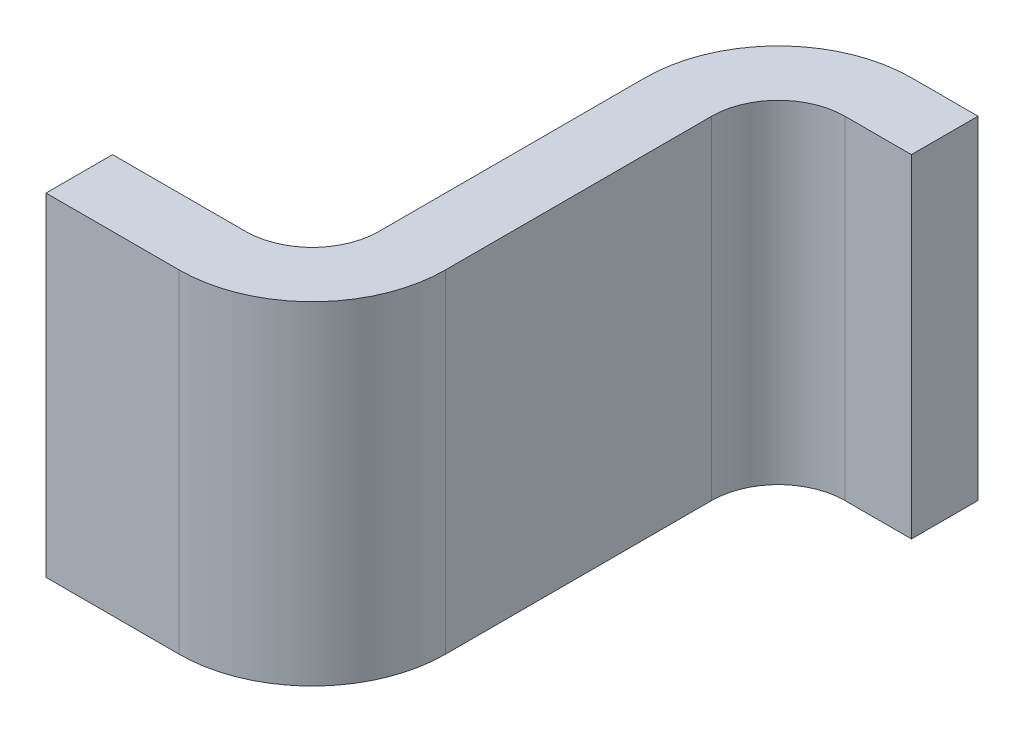
ISO-10303-21;
HEADER;
FILE_DESCRIPTION(('STEP AP214'),'2;1');
FILE_NAME('part.step','',(''),(''),'','','');
FILE_SCHEMA(('AUTOMOTIVE_DESIGN { 1 0 10303 214 1 1 1 1 }'));
ENDSEC;
DATA;
#1=APPLICATION_CONTEXT('core data for automotive mechanical design processes');
#2=APPLICATION_PROTOCOL_DEFINITION('international standard','automotive_design',2000,#1);
#3=PRODUCT_CONTEXT('',#1,'mechanical');
#4=PRODUCT('Part','Part','',(#3));
#5=PRODUCT_RELATED_PRODUCT_CATEGORY('part','',(#4));
#6=PRODUCT_DEFINITION_FORMATION('','',#4);
#7=PRODUCT_DEFINITION_CONTEXT('part definition',#1,'design');
#8=PRODUCT_DEFINITION('design','',#6,#7);
#9=PRODUCT_DEFINITION_SHAPE('','',#8);
#10=(LENGTH_UNIT() NAMED_UNIT(*) SI_UNIT(.MILLI.,.METRE.));
#11=(NAMED_UNIT(*) PLANE_ANGLE_UNIT() SI_UNIT($,.RADIAN.));
#12=(NAMED_UNIT(*) SI_UNIT($,.STERADIAN.) SOLID_ANGLE_UNIT());
#13=UNCERTAINTY_MEASURE_WITH_UNIT(LENGTH_MEASURE(1.E-05),#10,'distance_accuracy_value','');
#14=(GEOMETRIC_REPRESENTATION_CONTEXT(3) GLOBAL_UNCERTAINTY_ASSIGNED_CONTEXT((#13)) GLOBAL_UNIT_ASSIGNED_CONTEXT((#10,
#11,#12)) REPRESENTATION_CONTEXT('',''));
#15=CARTESIAN_POINT('',(0.,0.,0.));
#16=DIRECTION('',(0.,0.,1.));
#17=DIRECTION('',(1.,0.,0.));
#18=AXIS2_PLACEMENT_3D('',#15,#16,#17);
#19=CARTESIAN_POINT('',(0.,0.25,0.8));
#20=DIRECTION('',(0.,0.,-1.));
#21=DIRECTION('',(-1.,0.,0.));
#22=AXIS2_PLACEMENT_3D('',#19,#20,#21);
#23=PLANE('',#22);
#24=DIRECTION('',(1.,0.,0.));
#25=VECTOR('',#24,1.);
#26=CARTESIAN_POINT('',(0.,0.25,0.8));
#27=LINE('',#26,#25);
#28=CARTESIAN_POINT('',(0.2,0.25,0.8));
#29=VERTEX_POINT('',#28);
#30=CARTESIAN_POINT('',(0.,0.25,0.8));
#31=VERTEX_POINT('',#30);
#32=EDGE_CURVE('E85',#29,#31,#27,.F.);
#33=ORIENTED_EDGE('',*,*,#32,.T.);
#34=DIRECTION('',(0.,1.,0.));
#35=VECTOR('',#34,1.);
#36=CARTESIAN_POINT('',(0.,-0.25,0.8));
#37=LINE('',#36,#35);
#38=CARTESIAN_POINT('',(0.,-0.25,0.8));
#39=VERTEX_POINT('',#38);
#40=EDGE_CURVE('E111',#39,#31,#37,.T.);
#41=ORIENTED_EDGE('',*,*,#40,.F.);
#42=DIRECTION('',(1.,0.,0.));
#43=VECTOR('',#42,1.);
#44=CARTESIAN_POINT('',(0.,-0.25,0.8));
#45=LINE('',#44,#43);
#46=CARTESIAN_POINT('',(0.2,-0.25,0.8));
#47=VERTEX_POINT('',#46);
#48=EDGE_CURVE('E130',#39,#47,#45,.T.);
#49=ORIENTED_EDGE('',*,*,#48,.T.);
#50=DIRECTION('',(0.,1.,0.));
#51=VECTOR('',#50,1.);
#52=CARTESIAN_POINT('',(0.2,0.25,0.8));
#53=LINE('',#52,#51);
#54=EDGE_CURVE('E121',#29,#47,#53,.F.);
#55=ORIENTED_EDGE('',*,*,#54,.F.);
#56=EDGE_LOOP('',(#33,#41,#49,#55));
#57=FACE_BOUND('',#56,.T.);
#58=ADVANCED_FACE('F17',(#57),#23,.F.);
#59=CARTESIAN_POINT('',(0.5,0.25,0.1));
#60=DIRECTION('',(0.,0.,-1.));
#61=DIRECTION('',(-1.,0.,0.));
#62=AXIS2_PLACEMENT_3D('',#59,#60,#61);
#63=PLANE('',#62);
#64=DIRECTION('',(1.,0.,0.));
#65=VECTOR('',#64,1.);
#66=CARTESIAN_POINT('',(0.5,0.25,0.1));
#67=LINE('',#66,#65);
#68=CARTESIAN_POINT('',(0.6,0.25,0.1));
#69=VERTEX_POINT('',#68);
#70=CARTESIAN_POINT('',(0.5,0.25,0.1));
#71=VERTEX_POINT('',#70);
#72=EDGE_CURVE('E142',#69,#71,#67,.F.);
#73=ORIENTED_EDGE('',*,*,#72,.T.);
#74=DIRECTION('',(0.,-1.,0.));
#75=VECTOR('',#74,1.);
#76=CARTESIAN_POINT('',(0.5,0.25,0.1));
#77=LINE('',#76,#75);
#78=CARTESIAN_POINT('',(0.5,-0.25,0.1));
#79=VERTEX_POINT('',#78);
#80=EDGE_CURVE('E189',#71,#79,#77,.T.);
#81=ORIENTED_EDGE('',*,*,#80,.T.);
#82=DIRECTION('',(1.,0.,0.));
#83=VECTOR('',#82,1.);
#84=CARTESIAN_POINT('',(0.5,-0.25,0.1));
#85=LINE('',#84,#83);
#86=CARTESIAN_POINT('',(0.6,-0.25,0.1));
#87=VERTEX_POINT('',#86);
#88=EDGE_CURVE('E193',#79,#87,#85,.T.);
#89=ORIENTED_EDGE('',*,*,#88,.T.);
#90=DIRECTION('',(0.,1.,0.));
#91=VECTOR('',#90,1.);
#92=CARTESIAN_POINT('',(0.6,-0.25,0.1));
#93=LINE('',#92,#91);
#94=EDGE_CURVE('E96',#87,#69,#93,.T.);
#95=ORIENTED_EDGE('',*,*,#94,.T.);
#96=EDGE_LOOP('',(#73,#81,#89,#95));
#97=FACE_BOUND('',#96,.T.);
#98=ADVANCED_FACE('F230',(#97),#63,.F.);
#99=CARTESIAN_POINT('',(0.,-0.25,0.7));
#100=DIRECTION('',(-1.,0.,0.));
#101=DIRECTION('',(0.,0.,1.));
#102=AXIS2_PLACEMENT_3D('',#99,#100,#101);
#103=PLANE('',#102);
#104=DIRECTION('',(0.,0.,1.));
#105=VECTOR('',#104,1.);
#106=CARTESIAN_POINT('',(0.,0.25,0.7));
#107=LINE('',#106,#105);
#108=CARTESIAN_POINT('',(0.,0.25,0.7));
#109=VERTEX_POINT('',#108);
#110=EDGE_CURVE('E114',#31,#109,#107,.F.);
#111=ORIENTED_EDGE('',*,*,#110,.T.);
#112=DIRECTION('',(0.,1.,0.));
#113=VECTOR('',#112,1.);
#114=CARTESIAN_POINT('',(0.,-0.25,0.7));
#115=LINE('',#114,#113);
#116=CARTESIAN_POINT('',(0.,-0.25,0.7));
#117=VERTEX_POINT('',#116);
#118=EDGE_CURVE('E175',#109,#117,#115,.F.);
#119=ORIENTED_EDGE('',*,*,#118,.T.);
#120=DIRECTION('',(0.,0.,1.));
#121=VECTOR('',#120,1.);
#122=CARTESIAN_POINT('',(0.,-0.25,0.8));
#123=LINE('',#122,#121);
#124=EDGE_CURVE('E116',#117,#39,#123,.T.);
#125=ORIENTED_EDGE('',*,*,#124,.T.);
#126=ORIENTED_EDGE('',*,*,#40,.T.);
#127=EDGE_LOOP('',(#111,#119,#125,#126));
#128=FACE_BOUND('',#127,.T.);
#129=ADVANCED_FACE('F112',(#128),#103,.T.);
#130=CARTESIAN_POINT('',(0.2,0.25,0.6));
#131=DIRECTION('',(0.,1.,0.));
#132=DIRECTION('',(0.,0.,1.));
#133=AXIS2_PLACEMENT_3D('',#130,#131,#132);
#134=CYLINDRICAL_SURFACE('',#133,0.2);
#135=CARTESIAN_POINT('',(0.2,0.25,0.6));
#136=DIRECTION('',(0.,1.,0.));
#137=DIRECTION('',(0.,0.,1.));
#138=AXIS2_PLACEMENT_3D('',#135,#136,#137);
#139=CIRCLE('',#138,0.2);
#140=CARTESIAN_POINT('',(0.4,0.25,0.6));
#141=VERTEX_POINT('',#140);
#142=EDGE_CURVE('E20',#29,#141,#139,.T.);
#143=ORIENTED_EDGE('',*,*,#142,.F.);
#144=ORIENTED_EDGE('',*,*,#54,.T.);
#145=CARTESIAN_POINT('',(0.2,-0.25,0.6));
#146=DIRECTION('',(0.,1.,0.));
#147=DIRECTION('',(0.,0.,1.));
#148=AXIS2_PLACEMENT_3D('',#145,#146,#147);
#149=CIRCLE('',#148,0.2);
#150=CARTESIAN_POINT('',(0.4,-0.25,0.6));
#151=VERTEX_POINT('',#150);
#152=EDGE_CURVE('E166',#151,#47,#149,.F.);
#153=ORIENTED_EDGE('',*,*,#152,.F.);
#154=DIRECTION('',(0.,1.,0.));
#155=VECTOR('',#154,1.);
#156=CARTESIAN_POINT('',(0.4,0.25,0.6));
#157=LINE('',#156,#155);
#158=EDGE_CURVE('E168',#151,#141,#157,.T.);
#159=ORIENTED_EDGE('',*,*,#158,.T.);
#160=EDGE_LOOP('',(#143,#144,#153,#159));
#161=FACE_BOUND('',#160,.T.);
#162=ADVANCED_FACE('F220',(#161),#134,.T.);
#163=CARTESIAN_POINT('',(0.6,-0.25,0.));
#164=DIRECTION('',(-1.,0.,0.));
#165=DIRECTION('',(0.,0.,1.));
#166=AXIS2_PLACEMENT_3D('',#163,#164,#165);
#167=PLANE('',#166);
#168=DIRECTION('',(0.,0.,1.));
#169=VECTOR('',#168,1.);
#170=CARTESIAN_POINT('',(0.6,0.25,0.));
#171=LINE('',#170,#169);
#172=CARTESIAN_POINT('',(0.6,0.25,0.));
#173=VERTEX_POINT('',#172);
#174=EDGE_CURVE('E141',#69,#173,#171,.F.);
#175=ORIENTED_EDGE('',*,*,#174,.F.);
#176=ORIENTED_EDGE('',*,*,#94,.F.);
#177=DIRECTION('',(0.,0.,1.));
#178=VECTOR('',#177,1.);
#179=CARTESIAN_POINT('',(0.6,-0.25,0.1));
#180=LINE('',#179,#178);
#181=CARTESIAN_POINT('',(0.6,-0.25,0.));
#182=VERTEX_POINT('',#181);
#183=EDGE_CURVE('E192',#87,#182,#180,.F.);
#184=ORIENTED_EDGE('',*,*,#183,.T.);
#185=DIRECTION('',(0.,1.,0.));
#186=VECTOR('',#185,1.);
#187=CARTESIAN_POINT('',(0.6,-0.25,0.));
#188=LINE('',#187,#186);
#189=EDGE_CURVE('E161',#182,#173,#188,.T.);
#190=ORIENTED_EDGE('',*,*,#189,.T.);
#191=EDGE_LOOP('',(#175,#176,#184,#190));
#192=FACE_BOUND('',#191,.T.);
#193=ADVANCED_FACE('F232',(#192),#167,.F.);
#194=CARTESIAN_POINT('',(0.5,0.25,0.2));
#195=DIRECTION('',(0.,-1.,0.));
#196=DIRECTION('',(0.,0.,-1.));
#197=AXIS2_PLACEMENT_3D('',#194,#195,#196);
#198=CYLINDRICAL_SURFACE('',#197,0.1);
#199=CARTESIAN_POINT('',(0.5,0.25,0.2));
#200=DIRECTION('',(0.,-1.,0.));
#201=DIRECTION('',(0.,0.,-1.));
#202=AXIS2_PLACEMENT_3D('',#199,#200,#201);
#203=CIRCLE('',#202,0.1);
#204=CARTESIAN_POINT('',(0.4,0.25,0.2));
#205=VERTEX_POINT('',#204);
#206=EDGE_CURVE('E162',#205,#71,#203,.T.);
#207=ORIENTED_EDGE('',*,*,#206,.F.);
#208=DIRECTION('',(0.,1.,0.));
#209=VECTOR('',#208,1.);
#210=CARTESIAN_POINT('',(0.4,0.25,0.2));
#211=LINE('',#210,#209);
#212=CARTESIAN_POINT('',(0.4,-0.25,0.2));
#213=VERTEX_POINT('',#212);
#214=EDGE_CURVE('E165',#205,#213,#211,.F.);
#215=ORIENTED_EDGE('',*,*,#214,.T.);
#216=CARTESIAN_POINT('',(0.5,-0.25,0.2));
#217=DIRECTION('',(0.,-1.,0.));
#218=DIRECTION('',(0.,0.,-1.));
#219=AXIS2_PLACEMENT_3D('',#216,#217,#218);
#220=CIRCLE('',#219,0.1);
#221=EDGE_CURVE('E159',#79,#213,#220,.F.);
#222=ORIENTED_EDGE('',*,*,#221,.F.);
#223=ORIENTED_EDGE('',*,*,#80,.F.);
#224=EDGE_LOOP('',(#207,#215,#222,#223));
#225=FACE_BOUND('',#224,.T.);
#226=ADVANCED_FACE('F226',(#225),#198,.F.);
#227=CARTESIAN_POINT('',(0.,-0.25,0.7));
#228=DIRECTION('',(0.,0.,1.));
#229=DIRECTION('',(1.,0.,0.));
#230=AXIS2_PLACEMENT_3D('',#227,#228,#229);
#231=PLANE('',#230);
#232=DIRECTION('',(1.,0.,0.));
#233=VECTOR('',#232,1.);
#234=CARTESIAN_POINT('',(0.,-0.25,0.7));
#235=LINE('',#234,#233);
#236=CARTESIAN_POINT('',(0.2,-0.25,0.7));
#237=VERTEX_POINT('',#236);
#238=EDGE_CURVE('E169',#117,#237,#235,.T.);
#239=ORIENTED_EDGE('',*,*,#238,.F.);
#240=ORIENTED_EDGE('',*,*,#118,.F.);
#241=DIRECTION('',(1.,0.,0.));
#242=VECTOR('',#241,1.);
#243=CARTESIAN_POINT('',(0.,0.25,0.7));
#244=LINE('',#243,#242);
#245=CARTESIAN_POINT('',(0.2,0.25,0.7));
#246=VERTEX_POINT('',#245);
#247=EDGE_CURVE('E128',#246,#109,#244,.F.);
#248=ORIENTED_EDGE('',*,*,#247,.F.);
#249=DIRECTION('',(0.,1.,0.));
#250=VECTOR('',#249,1.);
#251=CARTESIAN_POINT('',(0.2,-0.25,0.7));
#252=LINE('',#251,#250);
#253=EDGE_CURVE('E155',#246,#237,#252,.F.);
#254=ORIENTED_EDGE('',*,*,#253,.T.);
#255=EDGE_LOOP('',(#239,#240,#248,#254));
#256=FACE_BOUND('',#255,.T.);
#257=ADVANCED_FACE('F266',(#256),#231,.F.);
#258=CARTESIAN_POINT('',(0.4,0.25,0.6));
#259=DIRECTION('',(-1.,0.,0.));
#260=DIRECTION('',(0.,0.,1.));
#261=AXIS2_PLACEMENT_3D('',#258,#259,#260);
#262=PLANE('',#261);
#263=DIRECTION('',(0.,0.,-1.));
#264=VECTOR('',#263,1.);
#265=CARTESIAN_POINT('',(0.4,0.25,0.6));
#266=LINE('',#265,#264);
#267=EDGE_CURVE('E158',#205,#141,#266,.F.);
#268=ORIENTED_EDGE('',*,*,#267,.T.);
#269=ORIENTED_EDGE('',*,*,#158,.F.);
#270=DIRECTION('',(0.,0.,1.));
#271=VECTOR('',#270,1.);
#272=CARTESIAN_POINT('',(0.4,-0.25,0.6));
#273=LINE('',#272,#271);
#274=EDGE_CURVE('E152',#151,#213,#273,.F.);
#275=ORIENTED_EDGE('',*,*,#274,.T.);
#276=ORIENTED_EDGE('',*,*,#214,.F.);
#277=EDGE_LOOP('',(#268,#269,#275,#276));
#278=FACE_BOUND('',#277,.T.);
#279=ADVANCED_FACE('F268',(#278),#262,.F.);
#280=CARTESIAN_POINT('',(0.5,-0.25,0.));
#281=DIRECTION('',(0.,0.,1.));
#282=DIRECTION('',(1.,0.,0.));
#283=AXIS2_PLACEMENT_3D('',#280,#281,#282);
#284=PLANE('',#283);
#285=DIRECTION('',(1.,0.,0.));
#286=VECTOR('',#285,1.);
#287=CARTESIAN_POINT('',(0.5,-0.25,0.));
#288=LINE('',#287,#286);
#289=CARTESIAN_POINT('',(0.5,-0.25,0.));
#290=VERTEX_POINT('',#289);
#291=EDGE_CURVE('E203',#290,#182,#288,.T.);
#292=ORIENTED_EDGE('',*,*,#291,.F.);
#293=DIRECTION('',(0.,-1.,0.));
#294=VECTOR('',#293,1.);
#295=CARTESIAN_POINT('',(0.5,-0.25,0.));
#296=LINE('',#295,#294);
#297=CARTESIAN_POINT('',(0.5,0.25,0.));
#298=VERTEX_POINT('',#297);
#299=EDGE_CURVE('E149',#298,#290,#296,.T.);
#300=ORIENTED_EDGE('',*,*,#299,.F.);
#301=DIRECTION('',(1.,0.,0.));
#302=VECTOR('',#301,1.);
#303=CARTESIAN_POINT('',(0.5,0.25,0.));
#304=LINE('',#303,#302);
#305=EDGE_CURVE('E164',#173,#298,#304,.F.);
#306=ORIENTED_EDGE('',*,*,#305,.F.);
#307=ORIENTED_EDGE('',*,*,#189,.F.);
#308=EDGE_LOOP('',(#292,#300,#306,#307));
#309=FACE_BOUND('',#308,.T.);
#310=ADVANCED_FACE('F238',(#309),#284,.F.);
#311=CARTESIAN_POINT('',(0.3,0.25,0.6));
#312=DIRECTION('',(0.,-1.,0.));
#313=DIRECTION('',(0.,0.,-1.));
#314=AXIS2_PLACEMENT_3D('',#311,#312,#313);
#315=PLANE('',#314);
#316=DIRECTION('',(0.,0.,-1.));
#317=VECTOR('',#316,1.);
#318=CARTESIAN_POINT('',(0.3,0.25,0.6));
#319=LINE('',#318,#317);
#320=CARTESIAN_POINT('',(0.3,0.25,0.2));
#321=VERTEX_POINT('',#320);
#322=CARTESIAN_POINT('',(0.3,0.25,0.6));
#323=VERTEX_POINT('',#322);
#324=EDGE_CURVE('E148',#321,#323,#319,.F.);
#325=ORIENTED_EDGE('',*,*,#324,.T.);
#326=CARTESIAN_POINT('',(0.2,0.25,0.6));
#327=DIRECTION('',(0.,1.,0.));
#328=DIRECTION('',(0.,0.,1.));
#329=AXIS2_PLACEMENT_3D('',#326,#327,#328);
#330=CIRCLE('',#329,0.1);
#331=EDGE_CURVE('E156',#323,#246,#330,.F.);
#332=ORIENTED_EDGE('',*,*,#331,.T.);
#333=ORIENTED_EDGE('',*,*,#247,.T.);
#334=ORIENTED_EDGE('',*,*,#110,.F.);
#335=ORIENTED_EDGE('',*,*,#32,.F.);
#336=ORIENTED_EDGE('',*,*,#142,.T.);
#337=ORIENTED_EDGE('',*,*,#267,.F.);
#338=ORIENTED_EDGE('',*,*,#206,.T.);
#339=ORIENTED_EDGE('',*,*,#72,.F.);
#340=ORIENTED_EDGE('',*,*,#174,.T.);
#341=ORIENTED_EDGE('',*,*,#305,.T.);
#342=CARTESIAN_POINT('',(0.5,0.25,0.2));
#343=DIRECTION('',(0.,-1.,0.));
#344=DIRECTION('',(0.,0.,-1.));
#345=AXIS2_PLACEMENT_3D('',#342,#343,#344);
#346=CIRCLE('',#345,0.2);
#347=EDGE_CURVE('E150',#321,#298,#346,.T.);
#348=ORIENTED_EDGE('',*,*,#347,.F.);
#349=EDGE_LOOP('',(#325,#332,#333,#334,#335,#336,#337,#338,#339,#340,#341,#348));
#350=FACE_BOUND('',#349,.T.);
#351=ADVANCED_FACE('F126',(#350),#315,.F.);
#352=CARTESIAN_POINT('',(0.2,-0.25,0.6));
#353=DIRECTION('',(0.,1.,0.));
#354=DIRECTION('',(0.,0.,1.));
#355=AXIS2_PLACEMENT_3D('',#352,#353,#354);
#356=CYLINDRICAL_SURFACE('',#355,0.1);
#357=CARTESIAN_POINT('',(0.2,-0.25,0.6));
#358=DIRECTION('',(0.,1.,0.));
#359=DIRECTION('',(0.,0.,1.));
#360=AXIS2_PLACEMENT_3D('',#357,#358,#359);
#361=CIRCLE('',#360,0.1);
#362=CARTESIAN_POINT('',(0.3,-0.25,0.6));
#363=VERTEX_POINT('',#362);
#364=EDGE_CURVE('E153',#237,#363,#361,.T.);
#365=ORIENTED_EDGE('',*,*,#364,.F.);
#366=ORIENTED_EDGE('',*,*,#253,.F.);
#367=ORIENTED_EDGE('',*,*,#331,.F.);
#368=DIRECTION('',(0.,1.,0.));
#369=VECTOR('',#368,1.);
#370=CARTESIAN_POINT('',(0.3,-0.25,0.6));
#371=LINE('',#370,#369);
#372=EDGE_CURVE('E251',#323,#363,#371,.F.);
#373=ORIENTED_EDGE('',*,*,#372,.T.);
#374=EDGE_LOOP('',(#365,#366,#367,#373));
#375=FACE_BOUND('',#374,.T.);
#376=ADVANCED_FACE('F263',(#375),#356,.F.);
#377=CARTESIAN_POINT('',(0.4,-0.25,0.6));
#378=DIRECTION('',(0.,1.,0.));
#379=DIRECTION('',(0.,0.,1.));
#380=AXIS2_PLACEMENT_3D('',#377,#378,#379);
#381=PLANE('',#380);
#382=ORIENTED_EDGE('',*,*,#274,.F.);
#383=ORIENTED_EDGE('',*,*,#152,.T.);
#384=ORIENTED_EDGE('',*,*,#48,.F.);
#385=ORIENTED_EDGE('',*,*,#124,.F.);
#386=ORIENTED_EDGE('',*,*,#238,.T.);
#387=ORIENTED_EDGE('',*,*,#364,.T.);
#388=DIRECTION('',(0.,0.,-1.));
#389=VECTOR('',#388,1.);
#390=CARTESIAN_POINT('',(0.3,-0.25,0.6));
#391=LINE('',#390,#389);
#392=CARTESIAN_POINT('',(0.3,-0.25,0.2));
#393=VERTEX_POINT('',#392);
#394=EDGE_CURVE('E26',#363,#393,#391,.T.);
#395=ORIENTED_EDGE('',*,*,#394,.T.);
#396=CARTESIAN_POINT('',(0.5,-0.25,0.2));
#397=DIRECTION('',(0.,-1.,0.));
#398=DIRECTION('',(0.,0.,-1.));
#399=AXIS2_PLACEMENT_3D('',#396,#397,#398);
#400=CIRCLE('',#399,0.2);
#401=EDGE_CURVE('E34',#290,#393,#400,.F.);
#402=ORIENTED_EDGE('',*,*,#401,.F.);
#403=ORIENTED_EDGE('',*,*,#291,.T.);
#404=ORIENTED_EDGE('',*,*,#183,.F.);
#405=ORIENTED_EDGE('',*,*,#88,.F.);
#406=ORIENTED_EDGE('',*,*,#221,.T.);
#407=EDGE_LOOP('',(#382,#383,#384,#385,#386,#387,#395,#402,#403,#404,#405,#406));
#408=FACE_BOUND('',#407,.T.);
#409=ADVANCED_FACE('F240',(#408),#381,.F.);
#410=CARTESIAN_POINT('',(0.5,-0.25,0.2));
#411=DIRECTION('',(0.,-1.,0.));
#412=DIRECTION('',(0.,0.,-1.));
#413=AXIS2_PLACEMENT_3D('',#410,#411,#412);
#414=CYLINDRICAL_SURFACE('',#413,0.2);
#415=ORIENTED_EDGE('',*,*,#401,.T.);
#416=DIRECTION('',(0.,1.,0.));
#417=VECTOR('',#416,1.);
#418=CARTESIAN_POINT('',(0.3,-0.25,0.2));
#419=LINE('',#418,#417);
#420=EDGE_CURVE('E11',#393,#321,#419,.T.);
#421=ORIENTED_EDGE('',*,*,#420,.T.);
#422=ORIENTED_EDGE('',*,*,#347,.T.);
#423=ORIENTED_EDGE('',*,*,#299,.T.);
#424=EDGE_LOOP('',(#415,#421,#422,#423));
#425=FACE_BOUND('',#424,.T.);
#426=ADVANCED_FACE('F260',(#425),#414,.T.);
#427=CARTESIAN_POINT('',(0.3,-0.25,0.6));
#428=DIRECTION('',(1.,0.,0.));
#429=DIRECTION('',(0.,0.,-1.));
#430=AXIS2_PLACEMENT_3D('',#427,#428,#429);
#431=PLANE('',#430);
#432=ORIENTED_EDGE('',*,*,#394,.F.);
#433=ORIENTED_EDGE('',*,*,#372,.F.);
#434=ORIENTED_EDGE('',*,*,#324,.F.);
#435=ORIENTED_EDGE('',*,*,#420,.F.);
#436=EDGE_LOOP('',(#432,#433,#434,#435));
#437=FACE_BOUND('',#436,.T.);
#438=ADVANCED_FACE('F258',(#437),#431,.F.);
#439=CLOSED_SHELL('',(#58,#98,#129,#162,#193,#226,#257,#279,#310,#351,#376,#409,#426,#438));
#440=MANIFOLD_SOLID_BREP('B1',#439);
#441=ADVANCED_BREP_SHAPE_REPRESENTATION('',(#18,#440),#14);
#442=SHAPE_DEFINITION_REPRESENTATION(#9,#441);
ENDSEC;
END-ISO-10303-21;
